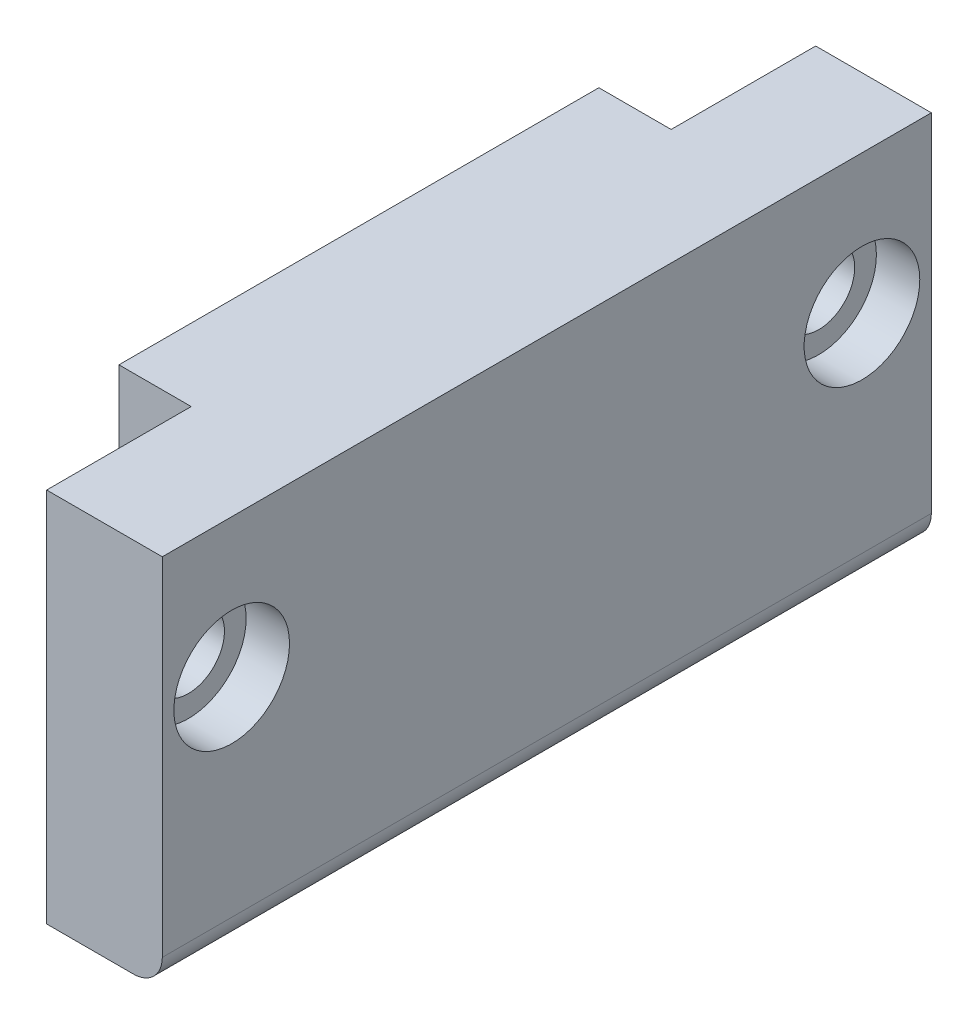
ISO-10303-21;
HEADER;
FILE_DESCRIPTION(('STEP AP214'),'2;1');
FILE_NAME('part.step','',(''),(''),'','','');
FILE_SCHEMA(('AUTOMOTIVE_DESIGN { 1 0 10303 214 1 1 1 1 }'));
ENDSEC;
DATA;
#1=APPLICATION_CONTEXT('core data for automotive mechanical design processes');
#2=APPLICATION_PROTOCOL_DEFINITION('international standard','automotive_design',2000,#1);
#3=PRODUCT_CONTEXT('',#1,'mechanical');
#4=PRODUCT('Part','Part','',(#3));
#5=PRODUCT_RELATED_PRODUCT_CATEGORY('part','',(#4));
#6=PRODUCT_DEFINITION_FORMATION('','',#4);
#7=PRODUCT_DEFINITION_CONTEXT('part definition',#1,'design');
#8=PRODUCT_DEFINITION('design','',#6,#7);
#9=PRODUCT_DEFINITION_SHAPE('','',#8);
#10=(LENGTH_UNIT() NAMED_UNIT(*) SI_UNIT(.MILLI.,.METRE.));
#11=(NAMED_UNIT(*) PLANE_ANGLE_UNIT() SI_UNIT($,.RADIAN.));
#12=(NAMED_UNIT(*) SI_UNIT($,.STERADIAN.) SOLID_ANGLE_UNIT());
#13=UNCERTAINTY_MEASURE_WITH_UNIT(LENGTH_MEASURE(1.E-05),#10,'distance_accuracy_value','');
#14=(GEOMETRIC_REPRESENTATION_CONTEXT(3) GLOBAL_UNCERTAINTY_ASSIGNED_CONTEXT((#13)) GLOBAL_UNIT_ASSIGNED_CONTEXT((#10,
#11,#12)) REPRESENTATION_CONTEXT('',''));
#15=CARTESIAN_POINT('',(0.,0.,0.));
#16=DIRECTION('',(0.,0.,1.));
#17=DIRECTION('',(1.,0.,0.));
#18=AXIS2_PLACEMENT_3D('',#15,#16,#17);
#19=CARTESIAN_POINT('',(13.65,4.,8.6));
#20=DIRECTION('',(0.,0.,1.));
#21=DIRECTION('',(1.,0.,0.));
#22=AXIS2_PLACEMENT_3D('',#19,#20,#21);
#23=CYLINDRICAL_SURFACE('',#22,1.);
#24=CARTESIAN_POINT('',(13.65,4.,-13.));
#25=DIRECTION('',(0.,0.,-1.));
#26=DIRECTION('',(1.,0.,0.));
#27=AXIS2_PLACEMENT_3D('',#24,#25,#26);
#28=CIRCLE('',#27,1.);
#29=CARTESIAN_POINT('',(14.65,4.,-13.));
#30=VERTEX_POINT('',#29);
#31=CARTESIAN_POINT('',(13.65,3.,-13.));
#32=VERTEX_POINT('',#31);
#33=EDGE_CURVE('E148',#30,#32,#28,.T.);
#34=ORIENTED_EDGE('',*,*,#33,.F.);
#35=DIRECTION('',(0.,0.,-1.));
#36=VECTOR('',#35,1.);
#37=CARTESIAN_POINT('',(14.65,4.,-20.3));
#38=LINE('',#37,#36);
#39=CARTESIAN_POINT('',(14.65,4.,13.6));
#40=VERTEX_POINT('',#39);
#41=EDGE_CURVE('E134',#40,#30,#38,.T.);
#42=ORIENTED_EDGE('',*,*,#41,.F.);
#43=CARTESIAN_POINT('',(13.65,4.,13.6));
#44=DIRECTION('',(0.,0.,1.));
#45=DIRECTION('',(-1.,0.,0.));
#46=AXIS2_PLACEMENT_3D('',#43,#44,#45);
#47=CIRCLE('',#46,1.);
#48=CARTESIAN_POINT('',(13.65,3.,13.6));
#49=VERTEX_POINT('',#48);
#50=EDGE_CURVE('E155',#49,#40,#47,.T.);
#51=ORIENTED_EDGE('',*,*,#50,.F.);
#52=DIRECTION('',(0.,0.,1.));
#53=VECTOR('',#52,1.);
#54=CARTESIAN_POINT('',(13.65,3.,8.6));
#55=LINE('',#54,#53);
#56=EDGE_CURVE('E150',#32,#49,#55,.T.);
#57=ORIENTED_EDGE('',*,*,#56,.F.);
#58=EDGE_LOOP('',(#34,#42,#51,#57));
#59=FACE_BOUND('',#58,.T.);
#60=ADVANCED_FACE('F16',(#59),#23,.T.);
#61=CARTESIAN_POINT('',(13.15,11.2,-10.6));
#62=DIRECTION('',(1.,0.,0.));
#63=DIRECTION('',(0.,0.,-1.));
#64=AXIS2_PLACEMENT_3D('',#61,#62,#63);
#65=CYLINDRICAL_SURFACE('',#64,2.);
#66=CARTESIAN_POINT('',(13.15,11.2,-10.6));
#67=DIRECTION('',(1.,0.,0.));
#68=DIRECTION('',(0.,0.,-1.));
#69=AXIS2_PLACEMENT_3D('',#66,#67,#68);
#70=CIRCLE('',#69,2.);
#71=CARTESIAN_POINT('',(13.15,11.2,-12.6));
#72=VERTEX_POINT('',#71);
#73=EDGE_CURVE('E10',#72,#72,#70,.T.);
#74=ORIENTED_EDGE('',*,*,#73,.F.);
#75=EDGE_LOOP('',(#74));
#76=FACE_BOUND('',#75,.T.);
#77=CARTESIAN_POINT('',(14.65,11.2,-10.6));
#78=DIRECTION('',(1.,0.,0.));
#79=DIRECTION('',(0.,0.,-1.));
#80=AXIS2_PLACEMENT_3D('',#77,#78,#79);
#81=CIRCLE('',#80,2.);
#82=CARTESIAN_POINT('',(14.65,11.2,-12.6));
#83=VERTEX_POINT('',#82);
#84=EDGE_CURVE('E221',#83,#83,#81,.T.);
#85=ORIENTED_EDGE('',*,*,#84,.T.);
#86=EDGE_LOOP('',(#85));
#87=FACE_BOUND('',#86,.T.);
#88=ADVANCED_FACE('F419',(#76,#87),#65,.F.);
#89=CARTESIAN_POINT('',(13.15,11.2,-10.6));
#90=DIRECTION('',(1.,0.,0.));
#91=DIRECTION('',(0.,0.,-1.));
#92=AXIS2_PLACEMENT_3D('',#89,#90,#91);
#93=PLANE('',#92);
#94=CARTESIAN_POINT('',(13.15,11.2,-10.6));
#95=DIRECTION('',(-1.,0.,0.));
#96=DIRECTION('',(0.,0.,-1.));
#97=AXIS2_PLACEMENT_3D('',#94,#95,#96);
#98=CIRCLE('',#97,1.25);
#99=CARTESIAN_POINT('',(13.15,11.2,-11.85));
#100=VERTEX_POINT('',#99);
#101=EDGE_CURVE('E217',#100,#100,#98,.T.);
#102=ORIENTED_EDGE('',*,*,#101,.T.);
#103=EDGE_LOOP('',(#102));
#104=FACE_BOUND('',#103,.T.);
#105=ORIENTED_EDGE('',*,*,#73,.T.);
#106=EDGE_LOOP('',(#105));
#107=FACE_BOUND('',#106,.T.);
#108=ADVANCED_FACE('F424',(#104,#107),#93,.T.);
#109=CARTESIAN_POINT('',(13.15,11.2,11.2));
#110=DIRECTION('',(1.,0.,0.));
#111=DIRECTION('',(0.,0.,-1.));
#112=AXIS2_PLACEMENT_3D('',#109,#110,#111);
#113=CYLINDRICAL_SURFACE('',#112,2.);
#114=CARTESIAN_POINT('',(13.15,11.2,11.2));
#115=DIRECTION('',(1.,0.,0.));
#116=DIRECTION('',(0.,0.,-1.));
#117=AXIS2_PLACEMENT_3D('',#114,#115,#116);
#118=CIRCLE('',#117,2.);
#119=CARTESIAN_POINT('',(13.15,11.2,9.2));
#120=VERTEX_POINT('',#119);
#121=EDGE_CURVE('E20',#120,#120,#118,.T.);
#122=ORIENTED_EDGE('',*,*,#121,.F.);
#123=EDGE_LOOP('',(#122));
#124=FACE_BOUND('',#123,.T.);
#125=CARTESIAN_POINT('',(14.65,11.2,11.2));
#126=DIRECTION('',(1.,0.,0.));
#127=DIRECTION('',(0.,0.,-1.));
#128=AXIS2_PLACEMENT_3D('',#125,#126,#127);
#129=CIRCLE('',#128,2.);
#130=CARTESIAN_POINT('',(14.65,11.2,9.2));
#131=VERTEX_POINT('',#130);
#132=EDGE_CURVE('E145',#131,#131,#129,.T.);
#133=ORIENTED_EDGE('',*,*,#132,.T.);
#134=EDGE_LOOP('',(#133));
#135=FACE_BOUND('',#134,.T.);
#136=ADVANCED_FACE('F492',(#124,#135),#113,.F.);
#137=CARTESIAN_POINT('',(13.15,11.2,11.2));
#138=DIRECTION('',(1.,0.,0.));
#139=DIRECTION('',(0.,0.,-1.));
#140=AXIS2_PLACEMENT_3D('',#137,#138,#139);
#141=PLANE('',#140);
#142=CARTESIAN_POINT('',(13.15,11.2,11.2));
#143=DIRECTION('',(-1.,0.,0.));
#144=DIRECTION('',(0.,0.,-1.));
#145=AXIS2_PLACEMENT_3D('',#142,#143,#144);
#146=CIRCLE('',#145,1.25);
#147=CARTESIAN_POINT('',(13.15,11.2,9.95));
#148=VERTEX_POINT('',#147);
#149=EDGE_CURVE('E194',#148,#148,#146,.T.);
#150=ORIENTED_EDGE('',*,*,#149,.T.);
#151=EDGE_LOOP('',(#150));
#152=FACE_BOUND('',#151,.T.);
#153=ORIENTED_EDGE('',*,*,#121,.T.);
#154=EDGE_LOOP('',(#153));
#155=FACE_BOUND('',#154,.T.);
#156=ADVANCED_FACE('F497',(#152,#155),#141,.T.);
#157=CARTESIAN_POINT('',(14.65,55.1,-20.3));
#158=DIRECTION('',(-1.,0.,0.));
#159=DIRECTION('',(0.,1.,0.));
#160=AXIS2_PLACEMENT_3D('',#157,#158,#159);
#161=PLANE('',#160);
#162=ORIENTED_EDGE('',*,*,#84,.F.);
#163=EDGE_LOOP('',(#162));
#164=FACE_BOUND('',#163,.T.);
#165=ORIENTED_EDGE('',*,*,#132,.F.);
#166=EDGE_LOOP('',(#165));
#167=FACE_BOUND('',#166,.T.);
#168=DIRECTION('',(0.,1.,0.));
#169=VECTOR('',#168,1.);
#170=CARTESIAN_POINT('',(14.65,3.,13.6));
#171=LINE('',#170,#169);
#172=CARTESIAN_POINT('',(14.65,16.,13.6));
#173=VERTEX_POINT('',#172);
#174=EDGE_CURVE('E141',#40,#173,#171,.T.);
#175=ORIENTED_EDGE('',*,*,#174,.F.);
#176=ORIENTED_EDGE('',*,*,#41,.T.);
#177=DIRECTION('',(0.,-1.,0.));
#178=VECTOR('',#177,1.);
#179=CARTESIAN_POINT('',(14.65,3.,-13.));
#180=LINE('',#179,#178);
#181=CARTESIAN_POINT('',(14.65,16.,-13.));
#182=VERTEX_POINT('',#181);
#183=EDGE_CURVE('E139',#182,#30,#180,.T.);
#184=ORIENTED_EDGE('',*,*,#183,.F.);
#185=DIRECTION('',(0.,0.,-1.));
#186=VECTOR('',#185,1.);
#187=CARTESIAN_POINT('',(14.65,16.,13.6));
#188=LINE('',#187,#186);
#189=EDGE_CURVE('E240',#173,#182,#188,.T.);
#190=ORIENTED_EDGE('',*,*,#189,.F.);
#191=EDGE_LOOP('',(#175,#176,#184,#190));
#192=FACE_BOUND('',#191,.T.);
#193=ADVANCED_FACE('F136',(#164,#167,#192),#161,.F.);
#194=CARTESIAN_POINT('',(44.2567559857543,3.,13.6));
#195=DIRECTION('',(0.,0.,-1.));
#196=DIRECTION('',(0.,-1.,0.));
#197=AXIS2_PLACEMENT_3D('',#194,#195,#196);
#198=PLANE('',#197);
#199=DIRECTION('',(-1.,0.,0.));
#200=VECTOR('',#199,1.);
#201=CARTESIAN_POINT('',(44.2567559857543,3.,13.6));
#202=LINE('',#201,#200);
#203=CARTESIAN_POINT('',(10.65,3.,13.6));
#204=VERTEX_POINT('',#203);
#205=EDGE_CURVE('E188',#49,#204,#202,.T.);
#206=ORIENTED_EDGE('',*,*,#205,.F.);
#207=ORIENTED_EDGE('',*,*,#50,.T.);
#208=ORIENTED_EDGE('',*,*,#174,.T.);
#209=DIRECTION('',(-1.,0.,0.));
#210=VECTOR('',#209,1.);
#211=CARTESIAN_POINT('',(44.2567559857543,16.,13.6));
#212=LINE('',#211,#210);
#213=CARTESIAN_POINT('',(10.65,16.,13.6));
#214=VERTEX_POINT('',#213);
#215=EDGE_CURVE('E171',#173,#214,#212,.T.);
#216=ORIENTED_EDGE('',*,*,#215,.T.);
#217=DIRECTION('',(0.,-1.,0.));
#218=VECTOR('',#217,1.);
#219=CARTESIAN_POINT('',(10.65,3.,13.6));
#220=LINE('',#219,#218);
#221=EDGE_CURVE('E167',#214,#204,#220,.T.);
#222=ORIENTED_EDGE('',*,*,#221,.T.);
#223=EDGE_LOOP('',(#206,#207,#208,#216,#222));
#224=FACE_BOUND('',#223,.T.);
#225=ADVANCED_FACE('F295',(#224),#198,.F.);
#226=CARTESIAN_POINT('',(44.2567559857543,3.,-13.));
#227=DIRECTION('',(0.,0.,1.));
#228=DIRECTION('',(1.,0.,0.));
#229=AXIS2_PLACEMENT_3D('',#226,#227,#228);
#230=PLANE('',#229);
#231=ORIENTED_EDGE('',*,*,#183,.T.);
#232=ORIENTED_EDGE('',*,*,#33,.T.);
#233=DIRECTION('',(-1.,0.,0.));
#234=VECTOR('',#233,1.);
#235=CARTESIAN_POINT('',(44.2567559857543,3.,-13.));
#236=LINE('',#235,#234);
#237=CARTESIAN_POINT('',(10.65,3.,-13.));
#238=VERTEX_POINT('',#237);
#239=EDGE_CURVE('E172',#32,#238,#236,.T.);
#240=ORIENTED_EDGE('',*,*,#239,.T.);
#241=DIRECTION('',(0.,1.,0.));
#242=VECTOR('',#241,1.);
#243=CARTESIAN_POINT('',(10.65,3.,-13.));
#244=LINE('',#243,#242);
#245=CARTESIAN_POINT('',(10.65,16.,-13.));
#246=VERTEX_POINT('',#245);
#247=EDGE_CURVE('E161',#238,#246,#244,.T.);
#248=ORIENTED_EDGE('',*,*,#247,.T.);
#249=DIRECTION('',(-1.,0.,0.));
#250=VECTOR('',#249,1.);
#251=CARTESIAN_POINT('',(44.2567559857543,16.,-13.));
#252=LINE('',#251,#250);
#253=EDGE_CURVE('E158',#182,#246,#252,.T.);
#254=ORIENTED_EDGE('',*,*,#253,.F.);
#255=EDGE_LOOP('',(#231,#232,#240,#248,#254));
#256=FACE_BOUND('',#255,.T.);
#257=ADVANCED_FACE('F156',(#256),#230,.F.);
#258=CARTESIAN_POINT('',(10.65,0.,0.));
#259=DIRECTION('',(-1.,0.,0.));
#260=DIRECTION('',(0.,0.,1.));
#261=AXIS2_PLACEMENT_3D('',#258,#259,#260);
#262=PLANE('',#261);
#263=CARTESIAN_POINT('',(10.65,11.2,-10.6));
#264=DIRECTION('',(1.,0.,0.));
#265=DIRECTION('',(0.,0.,1.));
#266=AXIS2_PLACEMENT_3D('',#263,#264,#265);
#267=CIRCLE('',#266,1.25);
#268=CARTESIAN_POINT('',(10.65,11.2,-9.35));
#269=VERTEX_POINT('',#268);
#270=EDGE_CURVE('E198',#269,#269,#267,.T.);
#271=ORIENTED_EDGE('',*,*,#270,.T.);
#272=EDGE_LOOP('',(#271));
#273=FACE_BOUND('',#272,.T.);
#274=DIRECTION('',(0.,0.,-1.));
#275=VECTOR('',#274,1.);
#276=CARTESIAN_POINT('',(10.65,3.,13.6));
#277=LINE('',#276,#275);
#278=CARTESIAN_POINT('',(10.65,3.,-8.));
#279=VERTEX_POINT('',#278);
#280=EDGE_CURVE('E193',#279,#238,#277,.T.);
#281=ORIENTED_EDGE('',*,*,#280,.F.);
#282=DIRECTION('',(0.,1.,0.));
#283=VECTOR('',#282,1.);
#284=CARTESIAN_POINT('',(10.65,3.,-8.));
#285=LINE('',#284,#283);
#286=CARTESIAN_POINT('',(10.65,16.,-8.));
#287=VERTEX_POINT('',#286);
#288=EDGE_CURVE('E245',#279,#287,#285,.T.);
#289=ORIENTED_EDGE('',*,*,#288,.T.);
#290=DIRECTION('',(0.,0.,1.));
#291=VECTOR('',#290,1.);
#292=CARTESIAN_POINT('',(10.65,16.,13.6));
#293=LINE('',#292,#291);
#294=EDGE_CURVE('E179',#246,#287,#293,.T.);
#295=ORIENTED_EDGE('',*,*,#294,.F.);
#296=ORIENTED_EDGE('',*,*,#247,.F.);
#297=EDGE_LOOP('',(#281,#289,#295,#296));
#298=FACE_BOUND('',#297,.T.);
#299=ADVANCED_FACE('F269',(#273,#298),#262,.T.);
#300=CARTESIAN_POINT('',(10.65,0.,0.));
#301=DIRECTION('',(-1.,0.,0.));
#302=DIRECTION('',(0.,0.,1.));
#303=AXIS2_PLACEMENT_3D('',#300,#301,#302);
#304=PLANE('',#303);
#305=CARTESIAN_POINT('',(10.65,11.2,11.2));
#306=DIRECTION('',(1.,0.,0.));
#307=DIRECTION('',(0.,0.,1.));
#308=AXIS2_PLACEMENT_3D('',#305,#306,#307);
#309=CIRCLE('',#308,1.25);
#310=CARTESIAN_POINT('',(10.65,11.2,12.45));
#311=VERTEX_POINT('',#310);
#312=EDGE_CURVE('E197',#311,#311,#309,.T.);
#313=ORIENTED_EDGE('',*,*,#312,.T.);
#314=EDGE_LOOP('',(#313));
#315=FACE_BOUND('',#314,.T.);
#316=DIRECTION('',(0.,0.,1.));
#317=VECTOR('',#316,1.);
#318=CARTESIAN_POINT('',(10.65,16.,13.6));
#319=LINE('',#318,#317);
#320=CARTESIAN_POINT('',(10.65,16.,8.6));
#321=VERTEX_POINT('',#320);
#322=EDGE_CURVE('E209',#321,#214,#319,.T.);
#323=ORIENTED_EDGE('',*,*,#322,.F.);
#324=DIRECTION('',(0.,-1.,0.));
#325=VECTOR('',#324,1.);
#326=CARTESIAN_POINT('',(10.65,3.,8.6));
#327=LINE('',#326,#325);
#328=CARTESIAN_POINT('',(10.65,3.,8.6));
#329=VERTEX_POINT('',#328);
#330=EDGE_CURVE('E220',#321,#329,#327,.T.);
#331=ORIENTED_EDGE('',*,*,#330,.T.);
#332=DIRECTION('',(0.,0.,-1.));
#333=VECTOR('',#332,1.);
#334=CARTESIAN_POINT('',(10.65,3.,13.6));
#335=LINE('',#334,#333);
#336=EDGE_CURVE('E184',#204,#329,#335,.T.);
#337=ORIENTED_EDGE('',*,*,#336,.F.);
#338=ORIENTED_EDGE('',*,*,#221,.F.);
#339=EDGE_LOOP('',(#323,#331,#337,#338));
#340=FACE_BOUND('',#339,.T.);
#341=ADVANCED_FACE('F289',(#315,#340),#304,.T.);
#342=CARTESIAN_POINT('',(8.15,0.,0.));
#343=DIRECTION('',(-1.,0.,0.));
#344=DIRECTION('',(0.,0.,1.));
#345=AXIS2_PLACEMENT_3D('',#342,#343,#344);
#346=PLANE('',#345);
#347=DIRECTION('',(0.,-1.,0.));
#348=VECTOR('',#347,1.);
#349=CARTESIAN_POINT('',(8.15,3.,8.6));
#350=LINE('',#349,#348);
#351=CARTESIAN_POINT('',(8.15,16.,8.6));
#352=VERTEX_POINT('',#351);
#353=CARTESIAN_POINT('',(8.15,3.,8.6));
#354=VERTEX_POINT('',#353);
#355=EDGE_CURVE('E183',#352,#354,#350,.T.);
#356=ORIENTED_EDGE('',*,*,#355,.F.);
#357=DIRECTION('',(0.,0.,1.));
#358=VECTOR('',#357,1.);
#359=CARTESIAN_POINT('',(8.15,16.,8.6));
#360=LINE('',#359,#358);
#361=CARTESIAN_POINT('',(8.15,16.,-8.));
#362=VERTEX_POINT('',#361);
#363=EDGE_CURVE('E176',#362,#352,#360,.T.);
#364=ORIENTED_EDGE('',*,*,#363,.F.);
#365=DIRECTION('',(0.,1.,0.));
#366=VECTOR('',#365,1.);
#367=CARTESIAN_POINT('',(8.15,3.,-8.));
#368=LINE('',#367,#366);
#369=CARTESIAN_POINT('',(8.15,3.,-8.));
#370=VERTEX_POINT('',#369);
#371=EDGE_CURVE('E210',#370,#362,#368,.T.);
#372=ORIENTED_EDGE('',*,*,#371,.F.);
#373=DIRECTION('',(0.,0.,-1.));
#374=VECTOR('',#373,1.);
#375=CARTESIAN_POINT('',(8.15,3.,8.6));
#376=LINE('',#375,#374);
#377=EDGE_CURVE('E187',#354,#370,#376,.T.);
#378=ORIENTED_EDGE('',*,*,#377,.F.);
#379=EDGE_LOOP('',(#356,#364,#372,#378));
#380=FACE_BOUND('',#379,.T.);
#381=ADVANCED_FACE('F283',(#380),#346,.T.);
#382=CARTESIAN_POINT('',(31.7345915303095,16.,8.6));
#383=DIRECTION('',(0.,-1.,0.));
#384=DIRECTION('',(0.,0.,-1.));
#385=AXIS2_PLACEMENT_3D('',#382,#383,#384);
#386=PLANE('',#385);
#387=DIRECTION('',(-1.,0.,0.));
#388=VECTOR('',#387,1.);
#389=CARTESIAN_POINT('',(31.7345915303095,16.,8.6));
#390=LINE('',#389,#388);
#391=EDGE_CURVE('E202',#321,#352,#390,.T.);
#392=ORIENTED_EDGE('',*,*,#391,.F.);
#393=ORIENTED_EDGE('',*,*,#322,.T.);
#394=ORIENTED_EDGE('',*,*,#215,.F.);
#395=ORIENTED_EDGE('',*,*,#189,.T.);
#396=ORIENTED_EDGE('',*,*,#253,.T.);
#397=ORIENTED_EDGE('',*,*,#294,.T.);
#398=DIRECTION('',(-1.,0.,0.));
#399=VECTOR('',#398,1.);
#400=CARTESIAN_POINT('',(31.7345915303095,16.,-8.));
#401=LINE('',#400,#399);
#402=EDGE_CURVE('E205',#287,#362,#401,.T.);
#403=ORIENTED_EDGE('',*,*,#402,.T.);
#404=ORIENTED_EDGE('',*,*,#363,.T.);
#405=EDGE_LOOP('',(#392,#393,#394,#395,#396,#397,#403,#404));
#406=FACE_BOUND('',#405,.T.);
#407=ADVANCED_FACE('F276',(#406),#386,.F.);
#408=CARTESIAN_POINT('',(31.7345915303095,3.,-8.));
#409=DIRECTION('',(0.,0.,1.));
#410=DIRECTION('',(1.,0.,0.));
#411=AXIS2_PLACEMENT_3D('',#408,#409,#410);
#412=PLANE('',#411);
#413=ORIENTED_EDGE('',*,*,#288,.F.);
#414=DIRECTION('',(-1.,0.,0.));
#415=VECTOR('',#414,1.);
#416=CARTESIAN_POINT('',(31.7345915303095,3.,-8.));
#417=LINE('',#416,#415);
#418=EDGE_CURVE('E189',#279,#370,#417,.T.);
#419=ORIENTED_EDGE('',*,*,#418,.T.);
#420=ORIENTED_EDGE('',*,*,#371,.T.);
#421=ORIENTED_EDGE('',*,*,#402,.F.);
#422=EDGE_LOOP('',(#413,#419,#420,#421));
#423=FACE_BOUND('',#422,.T.);
#424=ADVANCED_FACE('F273',(#423),#412,.F.);
#425=CARTESIAN_POINT('',(31.7345915303095,3.,8.6));
#426=DIRECTION('',(0.,1.,0.));
#427=DIRECTION('',(1.,0.,0.));
#428=AXIS2_PLACEMENT_3D('',#425,#426,#427);
#429=PLANE('',#428);
#430=ORIENTED_EDGE('',*,*,#239,.F.);
#431=ORIENTED_EDGE('',*,*,#56,.T.);
#432=ORIENTED_EDGE('',*,*,#205,.T.);
#433=ORIENTED_EDGE('',*,*,#336,.T.);
#434=DIRECTION('',(-1.,0.,0.));
#435=VECTOR('',#434,1.);
#436=CARTESIAN_POINT('',(31.7345915303095,3.,8.6));
#437=LINE('',#436,#435);
#438=EDGE_CURVE('E175',#329,#354,#437,.T.);
#439=ORIENTED_EDGE('',*,*,#438,.T.);
#440=ORIENTED_EDGE('',*,*,#377,.T.);
#441=ORIENTED_EDGE('',*,*,#418,.F.);
#442=ORIENTED_EDGE('',*,*,#280,.T.);
#443=EDGE_LOOP('',(#430,#431,#432,#433,#439,#440,#441,#442));
#444=FACE_BOUND('',#443,.T.);
#445=ADVANCED_FACE('F287',(#444),#429,.F.);
#446=CARTESIAN_POINT('',(31.7345915303095,3.,8.6));
#447=DIRECTION('',(0.,0.,-1.));
#448=DIRECTION('',(0.,-1.,0.));
#449=AXIS2_PLACEMENT_3D('',#446,#447,#448);
#450=PLANE('',#449);
#451=ORIENTED_EDGE('',*,*,#330,.F.);
#452=ORIENTED_EDGE('',*,*,#391,.T.);
#453=ORIENTED_EDGE('',*,*,#355,.T.);
#454=ORIENTED_EDGE('',*,*,#438,.F.);
#455=EDGE_LOOP('',(#451,#452,#453,#454));
#456=FACE_BOUND('',#455,.T.);
#457=ADVANCED_FACE('F285',(#456),#450,.F.);
#458=CARTESIAN_POINT('',(7.11446609406727,11.2,11.2));
#459=DIRECTION('',(1.,0.,0.));
#460=DIRECTION('',(0.,0.,-1.));
#461=AXIS2_PLACEMENT_3D('',#458,#459,#460);
#462=CYLINDRICAL_SURFACE('',#461,1.25);
#463=ORIENTED_EDGE('',*,*,#312,.F.);
#464=EDGE_LOOP('',(#463));
#465=FACE_BOUND('',#464,.T.);
#466=ORIENTED_EDGE('',*,*,#149,.F.);
#467=EDGE_LOOP('',(#466));
#468=FACE_BOUND('',#467,.T.);
#469=ADVANCED_FACE('F457',(#465,#468),#462,.F.);
#470=CARTESIAN_POINT('',(7.11446609406727,11.2,-10.6));
#471=DIRECTION('',(1.,0.,0.));
#472=DIRECTION('',(0.,0.,-1.));
#473=AXIS2_PLACEMENT_3D('',#470,#471,#472);
#474=CYLINDRICAL_SURFACE('',#473,1.25);
#475=ORIENTED_EDGE('',*,*,#270,.F.);
#476=EDGE_LOOP('',(#475));
#477=FACE_BOUND('',#476,.T.);
#478=ORIENTED_EDGE('',*,*,#101,.F.);
#479=EDGE_LOOP('',(#478));
#480=FACE_BOUND('',#479,.T.);
#481=ADVANCED_FACE('F18',(#477,#480),#474,.F.);
#482=CLOSED_SHELL('',(#60,#88,#108,#136,#156,#193,#225,#257,#299,#341,#381,#407,#424,#445,#457,
#469,#481));
#483=MANIFOLD_SOLID_BREP('B1',#482);
#484=ADVANCED_BREP_SHAPE_REPRESENTATION('',(#18,#483),#14);
#485=SHAPE_DEFINITION_REPRESENTATION(#9,#484);
ENDSEC;
END-ISO-10303-21;
